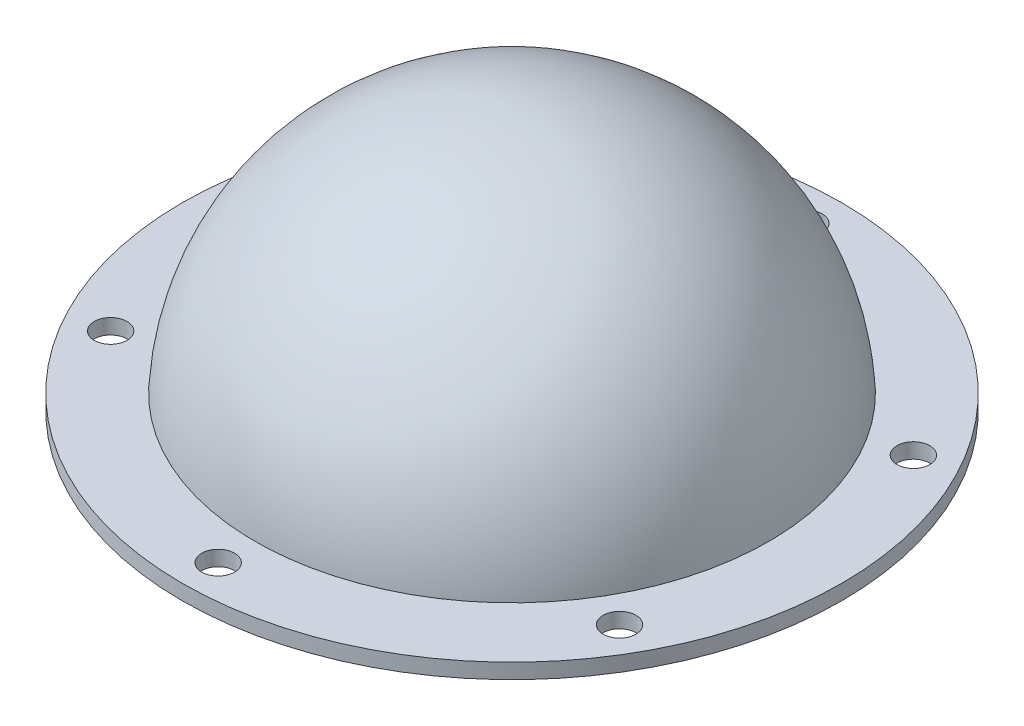
ISO-10303-21;
HEADER;
FILE_DESCRIPTION(('STEP AP214'),'2;1');
FILE_NAME('part.step','',(''),(''),'','','');
FILE_SCHEMA(('AUTOMOTIVE_DESIGN { 1 0 10303 214 1 1 1 1 }'));
ENDSEC;
DATA;
#1=APPLICATION_CONTEXT('core data for automotive mechanical design processes');
#2=APPLICATION_PROTOCOL_DEFINITION('international standard','automotive_design',2000,#1);
#3=PRODUCT_CONTEXT('',#1,'mechanical');
#4=PRODUCT('Part','Part','',(#3));
#5=PRODUCT_RELATED_PRODUCT_CATEGORY('part','',(#4));
#6=PRODUCT_DEFINITION_FORMATION('','',#4);
#7=PRODUCT_DEFINITION_CONTEXT('part definition',#1,'design');
#8=PRODUCT_DEFINITION('design','',#6,#7);
#9=PRODUCT_DEFINITION_SHAPE('','',#8);
#10=(LENGTH_UNIT() NAMED_UNIT(*) SI_UNIT(.MILLI.,.METRE.));
#11=(NAMED_UNIT(*) PLANE_ANGLE_UNIT() SI_UNIT($,.RADIAN.));
#12=(NAMED_UNIT(*) SI_UNIT($,.STERADIAN.) SOLID_ANGLE_UNIT());
#13=UNCERTAINTY_MEASURE_WITH_UNIT(LENGTH_MEASURE(1.E-05),#10,'distance_accuracy_value','');
#14=(GEOMETRIC_REPRESENTATION_CONTEXT(3) GLOBAL_UNCERTAINTY_ASSIGNED_CONTEXT((#13)) GLOBAL_UNIT_ASSIGNED_CONTEXT((#10,
#11,#12)) REPRESENTATION_CONTEXT('',''));
#15=CARTESIAN_POINT('',(0.,0.,0.));
#16=DIRECTION('',(0.,0.,1.));
#17=DIRECTION('',(1.,0.,0.));
#18=AXIS2_PLACEMENT_3D('',#15,#16,#17);
#19=CARTESIAN_POINT('',(0.,0.,0.));
#20=DIRECTION('',(0.,-1.,0.));
#21=DIRECTION('',(0.,0.,1.));
#22=AXIS2_PLACEMENT_3D('',#19,#20,#21);
#23=SPHERICAL_SURFACE('',#22,31.75);
#24=CARTESIAN_POINT('',(0.,0.,0.));
#25=DIRECTION('',(0.,-1.,0.));
#26=DIRECTION('',(0.,0.,-1.));
#27=AXIS2_PLACEMENT_3D('',#24,#25,#26);
#28=CIRCLE('',#27,31.75);
#29=CARTESIAN_POINT('',(0.,1.08910405714623E-13,-31.75));
#30=VERTEX_POINT('',#29);
#31=EDGE_CURVE('E10',#30,#30,#28,.T.);
#32=ORIENTED_EDGE('',*,*,#31,.T.);
#33=EDGE_LOOP('',(#32));
#34=FACE_BOUND('',#33,.T.);
#35=ADVANCED_FACE('F41',(#34),#23,.F.);
#36=CARTESIAN_POINT('',(0.,0.,31.75));
#37=DIRECTION('',(0.,1.,0.));
#38=DIRECTION('',(0.,0.,1.));
#39=AXIS2_PLACEMENT_3D('',#36,#37,#38);
#40=PLANE('',#39);
#41=CARTESIAN_POINT('',(0.,0.,38.5));
#42=DIRECTION('',(0.,1.,0.));
#43=DIRECTION('',(0.,0.,1.));
#44=AXIS2_PLACEMENT_3D('',#41,#42,#43);
#45=CIRCLE('',#44,2.15);
#46=CARTESIAN_POINT('',(0.,0.,40.65));
#47=VERTEX_POINT('',#46);
#48=EDGE_CURVE('E64',#47,#47,#45,.T.);
#49=ORIENTED_EDGE('',*,*,#48,.T.);
#50=EDGE_LOOP('',(#49));
#51=FACE_BOUND('',#50,.T.);
#52=CARTESIAN_POINT('',(33.3419780457009,0.,19.25));
#53=DIRECTION('',(0.,1.,0.));
#54=DIRECTION('',(0.,0.,1.));
#55=AXIS2_PLACEMENT_3D('',#52,#53,#54);
#56=CIRCLE('',#55,2.15);
#57=CARTESIAN_POINT('',(33.3419780457009,0.,21.4));
#58=VERTEX_POINT('',#57);
#59=EDGE_CURVE('E68',#58,#58,#56,.T.);
#60=ORIENTED_EDGE('',*,*,#59,.T.);
#61=EDGE_LOOP('',(#60));
#62=FACE_BOUND('',#61,.T.);
#63=CARTESIAN_POINT('',(33.3419780457009,1.94289029309402E-13,-19.25));
#64=DIRECTION('',(0.,1.,0.));
#65=DIRECTION('',(0.,0.,1.));
#66=AXIS2_PLACEMENT_3D('',#63,#64,#65);
#67=CIRCLE('',#66,2.15);
#68=CARTESIAN_POINT('',(33.3419780457009,1.86913993961798E-13,-17.1));
#69=VERTEX_POINT('',#68);
#70=EDGE_CURVE('E72',#69,#69,#67,.T.);
#71=ORIENTED_EDGE('',*,*,#70,.T.);
#72=EDGE_LOOP('',(#71));
#73=FACE_BOUND('',#72,.T.);
#74=CARTESIAN_POINT('',(0.,2.60208521396521E-13,-38.5));
#75=DIRECTION('',(0.,1.,0.));
#76=DIRECTION('',(0.,0.,1.));
#77=AXIS2_PLACEMENT_3D('',#74,#75,#76);
#78=CIRCLE('',#77,2.15);
#79=CARTESIAN_POINT('',(0.,2.52833486048917E-13,-36.35));
#80=VERTEX_POINT('',#79);
#81=EDGE_CURVE('E76',#80,#80,#78,.T.);
#82=ORIENTED_EDGE('',*,*,#81,.T.);
#83=EDGE_LOOP('',(#82));
#84=FACE_BOUND('',#83,.T.);
#85=CARTESIAN_POINT('',(-33.3419780457009,1.94289029309402E-13,-19.25));
#86=DIRECTION('',(0.,1.,0.));
#87=DIRECTION('',(0.,0.,1.));
#88=AXIS2_PLACEMENT_3D('',#85,#86,#87);
#89=CIRCLE('',#88,2.15);
#90=CARTESIAN_POINT('',(-33.3419780457009,1.86913993961798E-13,-17.1));
#91=VERTEX_POINT('',#90);
#92=EDGE_CURVE('E80',#91,#91,#89,.T.);
#93=ORIENTED_EDGE('',*,*,#92,.T.);
#94=EDGE_LOOP('',(#93));
#95=FACE_BOUND('',#94,.T.);
#96=CARTESIAN_POINT('',(-33.3419780457009,0.,19.25));
#97=DIRECTION('',(0.,1.,0.));
#98=DIRECTION('',(0.,0.,1.));
#99=AXIS2_PLACEMENT_3D('',#96,#97,#98);
#100=CIRCLE('',#99,2.15);
#101=CARTESIAN_POINT('',(-33.3419780457009,0.,21.4));
#102=VERTEX_POINT('',#101);
#103=EDGE_CURVE('E84',#102,#102,#100,.T.);
#104=ORIENTED_EDGE('',*,*,#103,.T.);
#105=EDGE_LOOP('',(#104));
#106=FACE_BOUND('',#105,.T.);
#107=ORIENTED_EDGE('',*,*,#31,.F.);
#108=EDGE_LOOP('',(#107));
#109=FACE_BOUND('',#108,.T.);
#110=CARTESIAN_POINT('',(0.,2.22044604925031E-13,0.));
#111=DIRECTION('',(0.,-1.,0.));
#112=DIRECTION('',(0.,0.,-1.));
#113=AXIS2_PLACEMENT_3D('',#110,#111,#112);
#114=CIRCLE('',#113,43.2009604540093);
#115=CARTESIAN_POINT('',(0.,3.702346562733E-13,-43.2009604540093));
#116=VERTEX_POINT('',#115);
#117=EDGE_CURVE('E48',#116,#116,#114,.T.);
#118=ORIENTED_EDGE('',*,*,#117,.T.);
#119=EDGE_LOOP('',(#118));
#120=FACE_BOUND('',#119,.T.);
#121=ADVANCED_FACE('F147',(#51,#62,#73,#84,#95,#106,#109,#120),#40,.F.);
#122=CARTESIAN_POINT('',(0.,-1000.,-3.43024899888577E-12));
#123=DIRECTION('',(0.,-1.,0.));
#124=DIRECTION('',(0.,0.,-1.));
#125=AXIS2_PLACEMENT_3D('',#122,#123,#124);
#126=CYLINDRICAL_SURFACE('',#125,43.2009604540093);
#127=ORIENTED_EDGE('',*,*,#117,.F.);
#128=EDGE_LOOP('',(#127));
#129=FACE_BOUND('',#128,.T.);
#130=CARTESIAN_POINT('',(0.,1.98437500000015,0.));
#131=DIRECTION('',(0.,-1.,0.));
#132=DIRECTION('',(0.,0.,-1.));
#133=AXIS2_PLACEMENT_3D('',#130,#131,#132);
#134=CIRCLE('',#133,43.2009604540093);
#135=CARTESIAN_POINT('',(0.,1.9843750000003,-43.2009604540093));
#136=VERTEX_POINT('',#135);
#137=EDGE_CURVE('E53',#136,#136,#134,.T.);
#138=ORIENTED_EDGE('',*,*,#137,.T.);
#139=EDGE_LOOP('',(#138));
#140=FACE_BOUND('',#139,.T.);
#141=ADVANCED_FACE('F120',(#129,#140),#126,.T.);
#142=CARTESIAN_POINT('',(0.,1.98437499999998,43.2009604540093));
#143=DIRECTION('',(0.,-1.,0.));
#144=DIRECTION('',(0.,0.,-1.));
#145=AXIS2_PLACEMENT_3D('',#142,#143,#144);
#146=PLANE('',#145);
#147=CARTESIAN_POINT('',(0.,1.984375,38.5));
#148=DIRECTION('',(0.,1.,0.));
#149=DIRECTION('',(0.,0.,1.));
#150=AXIS2_PLACEMENT_3D('',#147,#148,#149);
#151=CIRCLE('',#150,2.15);
#152=CARTESIAN_POINT('',(0.,1.98437499999999,40.65));
#153=VERTEX_POINT('',#152);
#154=EDGE_CURVE('E88',#153,#153,#151,.T.);
#155=ORIENTED_EDGE('',*,*,#154,.F.);
#156=EDGE_LOOP('',(#155));
#157=FACE_BOUND('',#156,.T.);
#158=CARTESIAN_POINT('',(33.3419780457009,1.98437500000006,19.25));
#159=DIRECTION('',(0.,1.,0.));
#160=DIRECTION('',(0.,0.,1.));
#161=AXIS2_PLACEMENT_3D('',#158,#159,#160);
#162=CIRCLE('',#161,2.15);
#163=CARTESIAN_POINT('',(33.3419780457009,1.98437500000006,21.4));
#164=VERTEX_POINT('',#163);
#165=EDGE_CURVE('E94',#164,#164,#162,.T.);
#166=ORIENTED_EDGE('',*,*,#165,.F.);
#167=EDGE_LOOP('',(#166));
#168=FACE_BOUND('',#167,.T.);
#169=CARTESIAN_POINT('',(33.3419780457009,1.9843750000002,-19.25));
#170=DIRECTION('',(0.,1.,0.));
#171=DIRECTION('',(0.,0.,1.));
#172=AXIS2_PLACEMENT_3D('',#169,#170,#171);
#173=CIRCLE('',#172,2.15);
#174=CARTESIAN_POINT('',(33.3419780457009,1.98437500000019,-17.1));
#175=VERTEX_POINT('',#174);
#176=EDGE_CURVE('E89',#175,#175,#173,.T.);
#177=ORIENTED_EDGE('',*,*,#176,.F.);
#178=EDGE_LOOP('',(#177));
#179=FACE_BOUND('',#178,.T.);
#180=CARTESIAN_POINT('',(0.,1.98437500000026,-38.5));
#181=DIRECTION('',(0.,1.,0.));
#182=DIRECTION('',(0.,0.,1.));
#183=AXIS2_PLACEMENT_3D('',#180,#181,#182);
#184=CIRCLE('',#183,2.15);
#185=CARTESIAN_POINT('',(0.,1.98437500000026,-36.35));
#186=VERTEX_POINT('',#185);
#187=EDGE_CURVE('E93',#186,#186,#184,.T.);
#188=ORIENTED_EDGE('',*,*,#187,.F.);
#189=EDGE_LOOP('',(#188));
#190=FACE_BOUND('',#189,.T.);
#191=CARTESIAN_POINT('',(-33.3419780457009,1.9843750000002,-19.25));
#192=DIRECTION('',(0.,1.,0.));
#193=DIRECTION('',(0.,0.,1.));
#194=AXIS2_PLACEMENT_3D('',#191,#192,#193);
#195=CIRCLE('',#194,2.15);
#196=CARTESIAN_POINT('',(-33.3419780457009,1.98437500000019,-17.1));
#197=VERTEX_POINT('',#196);
#198=EDGE_CURVE('E98',#197,#197,#195,.T.);
#199=ORIENTED_EDGE('',*,*,#198,.F.);
#200=EDGE_LOOP('',(#199));
#201=FACE_BOUND('',#200,.T.);
#202=CARTESIAN_POINT('',(-33.3419780457009,1.98437500000006,19.25));
#203=DIRECTION('',(0.,1.,0.));
#204=DIRECTION('',(0.,0.,1.));
#205=AXIS2_PLACEMENT_3D('',#202,#203,#204);
#206=CIRCLE('',#205,2.15);
#207=CARTESIAN_POINT('',(-33.3419780457009,1.98437500000006,21.4));
#208=VERTEX_POINT('',#207);
#209=EDGE_CURVE('E102',#208,#208,#206,.T.);
#210=ORIENTED_EDGE('',*,*,#209,.F.);
#211=EDGE_LOOP('',(#210));
#212=FACE_BOUND('',#211,.T.);
#213=ORIENTED_EDGE('',*,*,#137,.F.);
#214=EDGE_LOOP('',(#213));
#215=FACE_BOUND('',#214,.T.);
#216=CARTESIAN_POINT('',(0.,1.98437500000015,0.));
#217=DIRECTION('',(0.,-1.,0.));
#218=DIRECTION('',(0.,0.,-1.));
#219=AXIS2_PLACEMENT_3D('',#216,#217,#218);
#220=CIRCLE('',#219,33.6759604540093);
#221=CARTESIAN_POINT('',(0.,1.98437500000026,-33.6759604540093));
#222=VERTEX_POINT('',#221);
#223=EDGE_CURVE('E58',#222,#222,#220,.T.);
#224=ORIENTED_EDGE('',*,*,#223,.T.);
#225=EDGE_LOOP('',(#224));
#226=FACE_BOUND('',#225,.T.);
#227=ADVANCED_FACE('F116',(#157,#168,#179,#190,#201,#212,#215,#226),#146,.F.);
#228=CARTESIAN_POINT('',(0.,0.,0.));
#229=DIRECTION('',(0.,-1.,0.));
#230=DIRECTION('',(0.,0.,-1.));
#231=AXIS2_PLACEMENT_3D('',#228,#229,#230);
#232=SPHERICAL_SURFACE('',#231,33.734375);
#233=ORIENTED_EDGE('',*,*,#223,.F.);
#234=EDGE_LOOP('',(#233));
#235=FACE_BOUND('',#234,.T.);
#236=ADVANCED_FACE('F119',(#235),#232,.T.);
#237=CARTESIAN_POINT('',(-33.3419780457009,-8.01562499999994,19.25));
#238=DIRECTION('',(0.,1.,0.));
#239=DIRECTION('',(0.,0.,1.));
#240=AXIS2_PLACEMENT_3D('',#237,#238,#239);
#241=CYLINDRICAL_SURFACE('',#240,2.15);
#242=ORIENTED_EDGE('',*,*,#209,.T.);
#243=EDGE_LOOP('',(#242));
#244=FACE_BOUND('',#243,.T.);
#245=ORIENTED_EDGE('',*,*,#103,.F.);
#246=EDGE_LOOP('',(#245));
#247=FACE_BOUND('',#246,.T.);
#248=ADVANCED_FACE('F137',(#244,#247),#241,.F.);
#249=CARTESIAN_POINT('',(-33.3419780457009,-8.0156249999998,-19.25));
#250=DIRECTION('',(0.,1.,0.));
#251=DIRECTION('',(0.,0.,1.));
#252=AXIS2_PLACEMENT_3D('',#249,#250,#251);
#253=CYLINDRICAL_SURFACE('',#252,2.15);
#254=ORIENTED_EDGE('',*,*,#198,.T.);
#255=EDGE_LOOP('',(#254));
#256=FACE_BOUND('',#255,.T.);
#257=ORIENTED_EDGE('',*,*,#92,.F.);
#258=EDGE_LOOP('',(#257));
#259=FACE_BOUND('',#258,.T.);
#260=ADVANCED_FACE('F142',(#256,#259),#253,.F.);
#261=CARTESIAN_POINT('',(0.,-8.01562499999974,-38.5));
#262=DIRECTION('',(0.,1.,0.));
#263=DIRECTION('',(0.,0.,1.));
#264=AXIS2_PLACEMENT_3D('',#261,#262,#263);
#265=CYLINDRICAL_SURFACE('',#264,2.15);
#266=ORIENTED_EDGE('',*,*,#187,.T.);
#267=EDGE_LOOP('',(#266));
#268=FACE_BOUND('',#267,.T.);
#269=ORIENTED_EDGE('',*,*,#81,.F.);
#270=EDGE_LOOP('',(#269));
#271=FACE_BOUND('',#270,.T.);
#272=ADVANCED_FACE('F172',(#268,#271),#265,.F.);
#273=CARTESIAN_POINT('',(33.3419780457009,-8.0156249999998,-19.2500000000001));
#274=DIRECTION('',(0.,1.,0.));
#275=DIRECTION('',(0.,0.,1.));
#276=AXIS2_PLACEMENT_3D('',#273,#274,#275);
#277=CYLINDRICAL_SURFACE('',#276,2.15);
#278=ORIENTED_EDGE('',*,*,#176,.T.);
#279=EDGE_LOOP('',(#278));
#280=FACE_BOUND('',#279,.T.);
#281=ORIENTED_EDGE('',*,*,#70,.F.);
#282=EDGE_LOOP('',(#281));
#283=FACE_BOUND('',#282,.T.);
#284=ADVANCED_FACE('F178',(#280,#283),#277,.F.);
#285=CARTESIAN_POINT('',(33.3419780457009,-8.01562499999994,19.25));
#286=DIRECTION('',(0.,1.,0.));
#287=DIRECTION('',(0.,0.,1.));
#288=AXIS2_PLACEMENT_3D('',#285,#286,#287);
#289=CYLINDRICAL_SURFACE('',#288,2.15);
#290=ORIENTED_EDGE('',*,*,#165,.T.);
#291=EDGE_LOOP('',(#290));
#292=FACE_BOUND('',#291,.T.);
#293=ORIENTED_EDGE('',*,*,#59,.F.);
#294=EDGE_LOOP('',(#293));
#295=FACE_BOUND('',#294,.T.);
#296=ADVANCED_FACE('F183',(#292,#295),#289,.F.);
#297=CARTESIAN_POINT('',(0.,-8.015625,38.5));
#298=DIRECTION('',(0.,1.,0.));
#299=DIRECTION('',(0.,0.,1.));
#300=AXIS2_PLACEMENT_3D('',#297,#298,#299);
#301=CYLINDRICAL_SURFACE('',#300,2.15);
#302=ORIENTED_EDGE('',*,*,#154,.T.);
#303=EDGE_LOOP('',(#302));
#304=FACE_BOUND('',#303,.T.);
#305=ORIENTED_EDGE('',*,*,#48,.F.);
#306=EDGE_LOOP('',(#305));
#307=FACE_BOUND('',#306,.T.);
#308=ADVANCED_FACE('F113',(#304,#307),#301,.F.);
#309=CLOSED_SHELL('',(#35,#121,#141,#227,#236,#248,#260,#272,#284,#296,#308));
#310=MANIFOLD_SOLID_BREP('B2',#309);
#311=ADVANCED_BREP_SHAPE_REPRESENTATION('',(#18,#310),#14);
#312=SHAPE_DEFINITION_REPRESENTATION(#9,#311);
ENDSEC;
END-ISO-10303-21;
